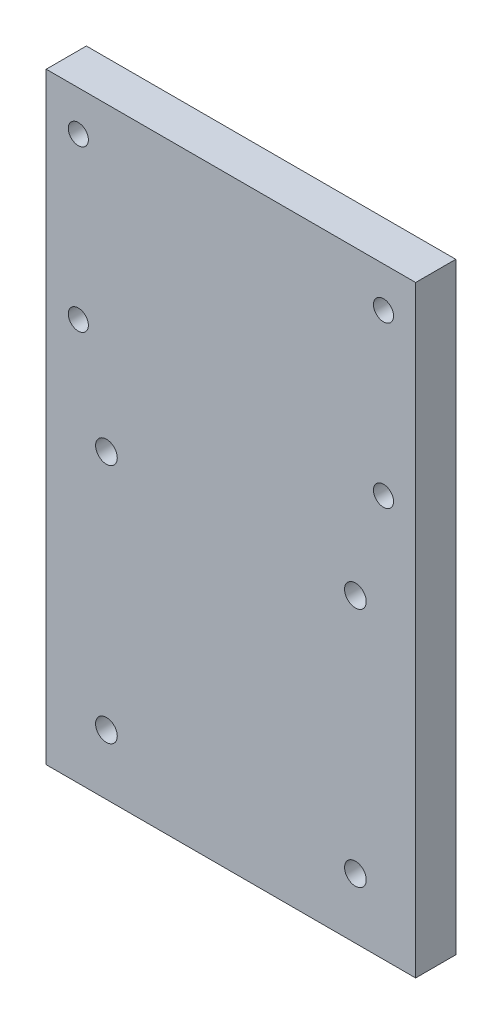
ISO-10303-21;
HEADER;
FILE_DESCRIPTION(('STEP AP214'),'2;1');
FILE_NAME('part.step','',(''),(''),'','','');
FILE_SCHEMA(('AUTOMOTIVE_DESIGN { 1 0 10303 214 1 1 1 1 }'));
ENDSEC;
DATA;
#1=APPLICATION_CONTEXT('core data for automotive mechanical design processes');
#2=APPLICATION_PROTOCOL_DEFINITION('international standard','automotive_design',2000,#1);
#3=PRODUCT_CONTEXT('',#1,'mechanical');
#4=PRODUCT('Part','Part','',(#3));
#5=PRODUCT_RELATED_PRODUCT_CATEGORY('part','',(#4));
#6=PRODUCT_DEFINITION_FORMATION('','',#4);
#7=PRODUCT_DEFINITION_CONTEXT('part definition',#1,'design');
#8=PRODUCT_DEFINITION('design','',#6,#7);
#9=PRODUCT_DEFINITION_SHAPE('','',#8);
#10=(LENGTH_UNIT() NAMED_UNIT(*) SI_UNIT(.MILLI.,.METRE.));
#11=(NAMED_UNIT(*) PLANE_ANGLE_UNIT() SI_UNIT($,.RADIAN.));
#12=(NAMED_UNIT(*) SI_UNIT($,.STERADIAN.) SOLID_ANGLE_UNIT());
#13=UNCERTAINTY_MEASURE_WITH_UNIT(LENGTH_MEASURE(1.E-05),#10,'distance_accuracy_value','');
#14=(GEOMETRIC_REPRESENTATION_CONTEXT(3) GLOBAL_UNCERTAINTY_ASSIGNED_CONTEXT((#13)) GLOBAL_UNIT_ASSIGNED_CONTEXT((#10,
#11,#12)) REPRESENTATION_CONTEXT('',''));
#15=CARTESIAN_POINT('',(0.,0.,0.));
#16=DIRECTION('',(0.,0.,1.));
#17=DIRECTION('',(1.,0.,0.));
#18=AXIS2_PLACEMENT_3D('',#15,#16,#17);
#19=CARTESIAN_POINT('',(0.,0.,5.));
#20=DIRECTION('',(0.,0.,-1.));
#21=DIRECTION('',(-1.,0.,0.));
#22=AXIS2_PLACEMENT_3D('',#19,#20,#21);
#23=PLANE('',#22);
#24=DIRECTION('',(0.,-1.,0.));
#25=VECTOR('',#24,1.);
#26=CARTESIAN_POINT('',(-23.,-37.5,5.));
#27=LINE('',#26,#25);
#28=CARTESIAN_POINT('',(-23.,37.5,5.));
#29=VERTEX_POINT('',#28);
#30=CARTESIAN_POINT('',(-23.,-37.5,5.));
#31=VERTEX_POINT('',#30);
#32=EDGE_CURVE('E86',#29,#31,#27,.T.);
#33=ORIENTED_EDGE('',*,*,#32,.T.);
#34=DIRECTION('',(1.,0.,0.));
#35=VECTOR('',#34,1.);
#36=CARTESIAN_POINT('',(-23.,-37.5,5.));
#37=LINE('',#36,#35);
#38=CARTESIAN_POINT('',(23.,-37.5,5.));
#39=VERTEX_POINT('',#38);
#40=EDGE_CURVE('E81',#31,#39,#37,.T.);
#41=ORIENTED_EDGE('',*,*,#40,.T.);
#42=DIRECTION('',(0.,1.,0.));
#43=VECTOR('',#42,1.);
#44=CARTESIAN_POINT('',(23.,-37.5,5.));
#45=LINE('',#44,#43);
#46=CARTESIAN_POINT('',(23.,37.5,5.));
#47=VERTEX_POINT('',#46);
#48=EDGE_CURVE('E84',#39,#47,#45,.T.);
#49=ORIENTED_EDGE('',*,*,#48,.T.);
#50=DIRECTION('',(-1.,0.,0.));
#51=VECTOR('',#50,1.);
#52=CARTESIAN_POINT('',(-23.,37.5,5.));
#53=LINE('',#52,#51);
#54=EDGE_CURVE('E51',#47,#29,#53,.T.);
#55=ORIENTED_EDGE('',*,*,#54,.T.);
#56=EDGE_LOOP('',(#33,#41,#49,#55));
#57=FACE_BOUND('',#56,.T.);
#58=CARTESIAN_POINT('',(-19.,32.5,5.));
#59=DIRECTION('',(0.,0.,1.));
#60=DIRECTION('',(1.,0.,0.));
#61=AXIS2_PLACEMENT_3D('',#58,#59,#60);
#62=CIRCLE('',#61,1.25);
#63=CARTESIAN_POINT('',(-17.75,32.5,5.));
#64=VERTEX_POINT('',#63);
#65=EDGE_CURVE('E101',#64,#64,#62,.T.);
#66=ORIENTED_EDGE('',*,*,#65,.F.);
#67=EDGE_LOOP('',(#66));
#68=FACE_BOUND('',#67,.T.);
#69=CARTESIAN_POINT('',(-15.5,-30.,5.));
#70=DIRECTION('',(0.,0.,1.));
#71=DIRECTION('',(1.,0.,0.));
#72=AXIS2_PLACEMENT_3D('',#69,#70,#71);
#73=CIRCLE('',#72,1.35);
#74=CARTESIAN_POINT('',(-14.15,-30.,5.));
#75=VERTEX_POINT('',#74);
#76=EDGE_CURVE('E116',#75,#75,#73,.T.);
#77=ORIENTED_EDGE('',*,*,#76,.F.);
#78=EDGE_LOOP('',(#77));
#79=FACE_BOUND('',#78,.T.);
#80=CARTESIAN_POINT('',(-15.5,0.,5.));
#81=DIRECTION('',(0.,0.,1.));
#82=DIRECTION('',(1.,0.,0.));
#83=AXIS2_PLACEMENT_3D('',#80,#81,#82);
#84=CIRCLE('',#83,1.35000000000001);
#85=CARTESIAN_POINT('',(-14.15,0.,5.));
#86=VERTEX_POINT('',#85);
#87=EDGE_CURVE('E122',#86,#86,#84,.T.);
#88=ORIENTED_EDGE('',*,*,#87,.F.);
#89=EDGE_LOOP('',(#88));
#90=FACE_BOUND('',#89,.T.);
#91=CARTESIAN_POINT('',(15.5,-30.,5.));
#92=DIRECTION('',(0.,0.,1.));
#93=DIRECTION('',(-1.,0.,0.));
#94=AXIS2_PLACEMENT_3D('',#91,#92,#93);
#95=CIRCLE('',#94,1.35);
#96=CARTESIAN_POINT('',(14.15,-30.,5.));
#97=VERTEX_POINT('',#96);
#98=EDGE_CURVE('E128',#97,#97,#95,.T.);
#99=ORIENTED_EDGE('',*,*,#98,.F.);
#100=EDGE_LOOP('',(#99));
#101=FACE_BOUND('',#100,.T.);
#102=CARTESIAN_POINT('',(15.5,0.,5.));
#103=DIRECTION('',(0.,0.,1.));
#104=DIRECTION('',(-1.,0.,0.));
#105=AXIS2_PLACEMENT_3D('',#102,#103,#104);
#106=CIRCLE('',#105,1.35000000000001);
#107=CARTESIAN_POINT('',(14.15,0.,5.));
#108=VERTEX_POINT('',#107);
#109=EDGE_CURVE('E134',#108,#108,#106,.T.);
#110=ORIENTED_EDGE('',*,*,#109,.F.);
#111=EDGE_LOOP('',(#110));
#112=FACE_BOUND('',#111,.T.);
#113=CARTESIAN_POINT('',(19.,32.5,5.));
#114=DIRECTION('',(0.,0.,1.));
#115=DIRECTION('',(-1.,0.,0.));
#116=AXIS2_PLACEMENT_3D('',#113,#114,#115);
#117=CIRCLE('',#116,1.25);
#118=CARTESIAN_POINT('',(17.75,32.5,5.));
#119=VERTEX_POINT('',#118);
#120=EDGE_CURVE('E140',#119,#119,#117,.T.);
#121=ORIENTED_EDGE('',*,*,#120,.F.);
#122=EDGE_LOOP('',(#121));
#123=FACE_BOUND('',#122,.T.);
#124=CARTESIAN_POINT('',(-19.,12.5,5.));
#125=DIRECTION('',(0.,0.,1.));
#126=DIRECTION('',(1.,0.,0.));
#127=AXIS2_PLACEMENT_3D('',#124,#125,#126);
#128=CIRCLE('',#127,1.25);
#129=CARTESIAN_POINT('',(-17.75,12.5,5.));
#130=VERTEX_POINT('',#129);
#131=EDGE_CURVE('E146',#130,#130,#128,.T.);
#132=ORIENTED_EDGE('',*,*,#131,.F.);
#133=EDGE_LOOP('',(#132));
#134=FACE_BOUND('',#133,.T.);
#135=CARTESIAN_POINT('',(19.,12.5,5.));
#136=DIRECTION('',(0.,0.,1.));
#137=DIRECTION('',(-1.,0.,0.));
#138=AXIS2_PLACEMENT_3D('',#135,#136,#137);
#139=CIRCLE('',#138,1.25);
#140=CARTESIAN_POINT('',(17.75,12.5,5.));
#141=VERTEX_POINT('',#140);
#142=EDGE_CURVE('E152',#141,#141,#139,.T.);
#143=ORIENTED_EDGE('',*,*,#142,.F.);
#144=EDGE_LOOP('',(#143));
#145=FACE_BOUND('',#144,.T.);
#146=ADVANCED_FACE('F34',(#57,#68,#79,#90,#101,#112,#123,#134,#145),#23,.F.);
#147=CARTESIAN_POINT('',(0.,0.,0.));
#148=DIRECTION('',(0.,0.,-1.));
#149=DIRECTION('',(-1.,0.,0.));
#150=AXIS2_PLACEMENT_3D('',#147,#148,#149);
#151=PLANE('',#150);
#152=CARTESIAN_POINT('',(-19.,12.5,0.));
#153=DIRECTION('',(0.,0.,1.));
#154=DIRECTION('',(1.,0.,0.));
#155=AXIS2_PLACEMENT_3D('',#152,#153,#154);
#156=CIRCLE('',#155,1.25);
#157=CARTESIAN_POINT('',(-17.75,12.5,0.));
#158=VERTEX_POINT('',#157);
#159=EDGE_CURVE('E149',#158,#158,#156,.T.);
#160=ORIENTED_EDGE('',*,*,#159,.T.);
#161=EDGE_LOOP('',(#160));
#162=FACE_BOUND('',#161,.T.);
#163=CARTESIAN_POINT('',(15.5,0.,0.));
#164=DIRECTION('',(0.,0.,1.));
#165=DIRECTION('',(-1.,0.,0.));
#166=AXIS2_PLACEMENT_3D('',#163,#164,#165);
#167=CIRCLE('',#166,1.35000000000001);
#168=CARTESIAN_POINT('',(14.15,0.,0.));
#169=VERTEX_POINT('',#168);
#170=EDGE_CURVE('E137',#169,#169,#167,.T.);
#171=ORIENTED_EDGE('',*,*,#170,.T.);
#172=EDGE_LOOP('',(#171));
#173=FACE_BOUND('',#172,.T.);
#174=CARTESIAN_POINT('',(-15.5,0.,0.));
#175=DIRECTION('',(0.,0.,1.));
#176=DIRECTION('',(1.,0.,0.));
#177=AXIS2_PLACEMENT_3D('',#174,#175,#176);
#178=CIRCLE('',#177,1.35000000000001);
#179=CARTESIAN_POINT('',(-14.15,0.,0.));
#180=VERTEX_POINT('',#179);
#181=EDGE_CURVE('E125',#180,#180,#178,.T.);
#182=ORIENTED_EDGE('',*,*,#181,.T.);
#183=EDGE_LOOP('',(#182));
#184=FACE_BOUND('',#183,.T.);
#185=CARTESIAN_POINT('',(-19.,32.5,0.));
#186=DIRECTION('',(0.,0.,1.));
#187=DIRECTION('',(1.,0.,0.));
#188=AXIS2_PLACEMENT_3D('',#185,#186,#187);
#189=CIRCLE('',#188,1.25);
#190=CARTESIAN_POINT('',(-17.75,32.5,0.));
#191=VERTEX_POINT('',#190);
#192=EDGE_CURVE('E113',#191,#191,#189,.T.);
#193=ORIENTED_EDGE('',*,*,#192,.T.);
#194=EDGE_LOOP('',(#193));
#195=FACE_BOUND('',#194,.T.);
#196=DIRECTION('',(0.,-1.,0.));
#197=VECTOR('',#196,1.);
#198=CARTESIAN_POINT('',(-23.,-37.5,0.));
#199=LINE('',#198,#197);
#200=CARTESIAN_POINT('',(-23.,37.5,0.));
#201=VERTEX_POINT('',#200);
#202=CARTESIAN_POINT('',(-23.,-37.5,0.));
#203=VERTEX_POINT('',#202);
#204=EDGE_CURVE('E98',#201,#203,#199,.T.);
#205=ORIENTED_EDGE('',*,*,#204,.F.);
#206=DIRECTION('',(-1.,0.,0.));
#207=VECTOR('',#206,1.);
#208=CARTESIAN_POINT('',(-23.,37.5,0.));
#209=LINE('',#208,#207);
#210=CARTESIAN_POINT('',(23.,37.5,0.));
#211=VERTEX_POINT('',#210);
#212=EDGE_CURVE('E74',#211,#201,#209,.T.);
#213=ORIENTED_EDGE('',*,*,#212,.F.);
#214=DIRECTION('',(0.,1.,0.));
#215=VECTOR('',#214,1.);
#216=CARTESIAN_POINT('',(23.,-37.5,0.));
#217=LINE('',#216,#215);
#218=CARTESIAN_POINT('',(23.,-37.5,0.));
#219=VERTEX_POINT('',#218);
#220=EDGE_CURVE('E68',#219,#211,#217,.T.);
#221=ORIENTED_EDGE('',*,*,#220,.F.);
#222=DIRECTION('',(1.,0.,0.));
#223=VECTOR('',#222,1.);
#224=CARTESIAN_POINT('',(-23.,-37.5,0.));
#225=LINE('',#224,#223);
#226=EDGE_CURVE('E90',#203,#219,#225,.T.);
#227=ORIENTED_EDGE('',*,*,#226,.F.);
#228=EDGE_LOOP('',(#205,#213,#221,#227));
#229=FACE_BOUND('',#228,.T.);
#230=CARTESIAN_POINT('',(-15.5,-30.,0.));
#231=DIRECTION('',(0.,0.,1.));
#232=DIRECTION('',(1.,0.,0.));
#233=AXIS2_PLACEMENT_3D('',#230,#231,#232);
#234=CIRCLE('',#233,1.35);
#235=CARTESIAN_POINT('',(-14.15,-30.,0.));
#236=VERTEX_POINT('',#235);
#237=EDGE_CURVE('E119',#236,#236,#234,.T.);
#238=ORIENTED_EDGE('',*,*,#237,.T.);
#239=EDGE_LOOP('',(#238));
#240=FACE_BOUND('',#239,.T.);
#241=CARTESIAN_POINT('',(15.5,-30.,0.));
#242=DIRECTION('',(0.,0.,1.));
#243=DIRECTION('',(-1.,0.,0.));
#244=AXIS2_PLACEMENT_3D('',#241,#242,#243);
#245=CIRCLE('',#244,1.35);
#246=CARTESIAN_POINT('',(14.15,-30.,0.));
#247=VERTEX_POINT('',#246);
#248=EDGE_CURVE('E131',#247,#247,#245,.T.);
#249=ORIENTED_EDGE('',*,*,#248,.T.);
#250=EDGE_LOOP('',(#249));
#251=FACE_BOUND('',#250,.T.);
#252=CARTESIAN_POINT('',(19.,32.5,0.));
#253=DIRECTION('',(0.,0.,1.));
#254=DIRECTION('',(-1.,0.,0.));
#255=AXIS2_PLACEMENT_3D('',#252,#253,#254);
#256=CIRCLE('',#255,1.25);
#257=CARTESIAN_POINT('',(17.75,32.5,0.));
#258=VERTEX_POINT('',#257);
#259=EDGE_CURVE('E143',#258,#258,#256,.T.);
#260=ORIENTED_EDGE('',*,*,#259,.T.);
#261=EDGE_LOOP('',(#260));
#262=FACE_BOUND('',#261,.T.);
#263=CARTESIAN_POINT('',(19.,12.5,0.));
#264=DIRECTION('',(0.,0.,1.));
#265=DIRECTION('',(-1.,0.,0.));
#266=AXIS2_PLACEMENT_3D('',#263,#264,#265);
#267=CIRCLE('',#266,1.25);
#268=CARTESIAN_POINT('',(17.75,12.5,0.));
#269=VERTEX_POINT('',#268);
#270=EDGE_CURVE('E155',#269,#269,#267,.T.);
#271=ORIENTED_EDGE('',*,*,#270,.T.);
#272=EDGE_LOOP('',(#271));
#273=FACE_BOUND('',#272,.T.);
#274=ADVANCED_FACE('F109',(#162,#173,#184,#195,#229,#240,#251,#262,#273),#151,.T.);
#275=CARTESIAN_POINT('',(-23.,-37.5,5.));
#276=DIRECTION('',(1.,0.,0.));
#277=DIRECTION('',(0.,0.,-1.));
#278=AXIS2_PLACEMENT_3D('',#275,#276,#277);
#279=PLANE('',#278);
#280=ORIENTED_EDGE('',*,*,#204,.T.);
#281=DIRECTION('',(0.,0.,-1.));
#282=VECTOR('',#281,1.);
#283=CARTESIAN_POINT('',(-23.,-37.5,5.));
#284=LINE('',#283,#282);
#285=EDGE_CURVE('E11',#31,#203,#284,.T.);
#286=ORIENTED_EDGE('',*,*,#285,.F.);
#287=ORIENTED_EDGE('',*,*,#32,.F.);
#288=DIRECTION('',(0.,0.,-1.));
#289=VECTOR('',#288,1.);
#290=CARTESIAN_POINT('',(-23.,37.5,5.));
#291=LINE('',#290,#289);
#292=EDGE_CURVE('E94',#29,#201,#291,.T.);
#293=ORIENTED_EDGE('',*,*,#292,.T.);
#294=EDGE_LOOP('',(#280,#286,#287,#293));
#295=FACE_BOUND('',#294,.T.);
#296=ADVANCED_FACE('F36',(#295),#279,.F.);
#297=CARTESIAN_POINT('',(-23.,-37.5,5.));
#298=DIRECTION('',(0.,1.,0.));
#299=DIRECTION('',(0.,0.,1.));
#300=AXIS2_PLACEMENT_3D('',#297,#298,#299);
#301=PLANE('',#300);
#302=ORIENTED_EDGE('',*,*,#226,.T.);
#303=DIRECTION('',(0.,0.,-1.));
#304=VECTOR('',#303,1.);
#305=CARTESIAN_POINT('',(23.,-37.5,5.));
#306=LINE('',#305,#304);
#307=EDGE_CURVE('E43',#39,#219,#306,.T.);
#308=ORIENTED_EDGE('',*,*,#307,.F.);
#309=ORIENTED_EDGE('',*,*,#40,.F.);
#310=ORIENTED_EDGE('',*,*,#285,.T.);
#311=EDGE_LOOP('',(#302,#308,#309,#310));
#312=FACE_BOUND('',#311,.T.);
#313=ADVANCED_FACE('F89',(#312),#301,.F.);
#314=CARTESIAN_POINT('',(23.,-37.5,5.));
#315=DIRECTION('',(-1.,0.,0.));
#316=DIRECTION('',(0.,0.,1.));
#317=AXIS2_PLACEMENT_3D('',#314,#315,#316);
#318=PLANE('',#317);
#319=ORIENTED_EDGE('',*,*,#220,.T.);
#320=DIRECTION('',(0.,0.,-1.));
#321=VECTOR('',#320,1.);
#322=CARTESIAN_POINT('',(23.,37.5,5.));
#323=LINE('',#322,#321);
#324=EDGE_CURVE('E91',#47,#211,#323,.T.);
#325=ORIENTED_EDGE('',*,*,#324,.F.);
#326=ORIENTED_EDGE('',*,*,#48,.F.);
#327=ORIENTED_EDGE('',*,*,#307,.T.);
#328=EDGE_LOOP('',(#319,#325,#326,#327));
#329=FACE_BOUND('',#328,.T.);
#330=ADVANCED_FACE('F92',(#329),#318,.F.);
#331=CARTESIAN_POINT('',(-23.,37.5,5.));
#332=DIRECTION('',(0.,-1.,0.));
#333=DIRECTION('',(0.,0.,-1.));
#334=AXIS2_PLACEMENT_3D('',#331,#332,#333);
#335=PLANE('',#334);
#336=ORIENTED_EDGE('',*,*,#212,.T.);
#337=ORIENTED_EDGE('',*,*,#292,.F.);
#338=ORIENTED_EDGE('',*,*,#54,.F.);
#339=ORIENTED_EDGE('',*,*,#324,.T.);
#340=EDGE_LOOP('',(#336,#337,#338,#339));
#341=FACE_BOUND('',#340,.T.);
#342=ADVANCED_FACE('F106',(#341),#335,.F.);
#343=CARTESIAN_POINT('',(-19.,32.5,5.));
#344=DIRECTION('',(0.,0.,-1.));
#345=DIRECTION('',(-1.,0.,0.));
#346=AXIS2_PLACEMENT_3D('',#343,#344,#345);
#347=CYLINDRICAL_SURFACE('',#346,1.25);
#348=ORIENTED_EDGE('',*,*,#65,.T.);
#349=EDGE_LOOP('',(#348));
#350=FACE_BOUND('',#349,.T.);
#351=ORIENTED_EDGE('',*,*,#192,.F.);
#352=EDGE_LOOP('',(#351));
#353=FACE_BOUND('',#352,.T.);
#354=ADVANCED_FACE('F172',(#350,#353),#347,.F.);
#355=CARTESIAN_POINT('',(-15.5,-30.,5.));
#356=DIRECTION('',(0.,0.,-1.));
#357=DIRECTION('',(-1.,0.,0.));
#358=AXIS2_PLACEMENT_3D('',#355,#356,#357);
#359=CYLINDRICAL_SURFACE('',#358,1.35);
#360=ORIENTED_EDGE('',*,*,#76,.T.);
#361=EDGE_LOOP('',(#360));
#362=FACE_BOUND('',#361,.T.);
#363=ORIENTED_EDGE('',*,*,#237,.F.);
#364=EDGE_LOOP('',(#363));
#365=FACE_BOUND('',#364,.T.);
#366=ADVANCED_FACE('F218',(#362,#365),#359,.F.);
#367=CARTESIAN_POINT('',(-15.5,0.,5.));
#368=DIRECTION('',(0.,0.,-1.));
#369=DIRECTION('',(-1.,0.,0.));
#370=AXIS2_PLACEMENT_3D('',#367,#368,#369);
#371=CYLINDRICAL_SURFACE('',#370,1.35000000000001);
#372=ORIENTED_EDGE('',*,*,#87,.T.);
#373=EDGE_LOOP('',(#372));
#374=FACE_BOUND('',#373,.T.);
#375=ORIENTED_EDGE('',*,*,#181,.F.);
#376=EDGE_LOOP('',(#375));
#377=FACE_BOUND('',#376,.T.);
#378=ADVANCED_FACE('F226',(#374,#377),#371,.F.);
#379=CARTESIAN_POINT('',(15.5,-30.,5.));
#380=DIRECTION('',(0.,0.,-1.));
#381=DIRECTION('',(-1.,0.,0.));
#382=AXIS2_PLACEMENT_3D('',#379,#380,#381);
#383=CYLINDRICAL_SURFACE('',#382,1.35);
#384=ORIENTED_EDGE('',*,*,#98,.T.);
#385=EDGE_LOOP('',(#384));
#386=FACE_BOUND('',#385,.T.);
#387=ORIENTED_EDGE('',*,*,#248,.F.);
#388=EDGE_LOOP('',(#387));
#389=FACE_BOUND('',#388,.T.);
#390=ADVANCED_FACE('F234',(#386,#389),#383,.F.);
#391=CARTESIAN_POINT('',(15.5,0.,5.));
#392=DIRECTION('',(0.,0.,-1.));
#393=DIRECTION('',(-1.,0.,0.));
#394=AXIS2_PLACEMENT_3D('',#391,#392,#393);
#395=CYLINDRICAL_SURFACE('',#394,1.35000000000001);
#396=ORIENTED_EDGE('',*,*,#109,.T.);
#397=EDGE_LOOP('',(#396));
#398=FACE_BOUND('',#397,.T.);
#399=ORIENTED_EDGE('',*,*,#170,.F.);
#400=EDGE_LOOP('',(#399));
#401=FACE_BOUND('',#400,.T.);
#402=ADVANCED_FACE('F243',(#398,#401),#395,.F.);
#403=CARTESIAN_POINT('',(19.,32.5,5.));
#404=DIRECTION('',(0.,0.,-1.));
#405=DIRECTION('',(-1.,0.,0.));
#406=AXIS2_PLACEMENT_3D('',#403,#404,#405);
#407=CYLINDRICAL_SURFACE('',#406,1.25);
#408=ORIENTED_EDGE('',*,*,#120,.T.);
#409=EDGE_LOOP('',(#408));
#410=FACE_BOUND('',#409,.T.);
#411=ORIENTED_EDGE('',*,*,#259,.F.);
#412=EDGE_LOOP('',(#411));
#413=FACE_BOUND('',#412,.T.);
#414=ADVANCED_FACE('F252',(#410,#413),#407,.F.);
#415=CARTESIAN_POINT('',(-19.,12.5,5.));
#416=DIRECTION('',(0.,0.,-1.));
#417=DIRECTION('',(-1.,0.,0.));
#418=AXIS2_PLACEMENT_3D('',#415,#416,#417);
#419=CYLINDRICAL_SURFACE('',#418,1.25);
#420=ORIENTED_EDGE('',*,*,#131,.T.);
#421=EDGE_LOOP('',(#420));
#422=FACE_BOUND('',#421,.T.);
#423=ORIENTED_EDGE('',*,*,#159,.F.);
#424=EDGE_LOOP('',(#423));
#425=FACE_BOUND('',#424,.T.);
#426=ADVANCED_FACE('F261',(#422,#425),#419,.F.);
#427=CARTESIAN_POINT('',(19.,12.5,5.));
#428=DIRECTION('',(0.,0.,-1.));
#429=DIRECTION('',(-1.,0.,0.));
#430=AXIS2_PLACEMENT_3D('',#427,#428,#429);
#431=CYLINDRICAL_SURFACE('',#430,1.25);
#432=ORIENTED_EDGE('',*,*,#142,.T.);
#433=EDGE_LOOP('',(#432));
#434=FACE_BOUND('',#433,.T.);
#435=ORIENTED_EDGE('',*,*,#270,.F.);
#436=EDGE_LOOP('',(#435));
#437=FACE_BOUND('',#436,.T.);
#438=ADVANCED_FACE('F161',(#434,#437),#431,.F.);
#439=CLOSED_SHELL('',(#146,#274,#296,#313,#330,#342,#354,#366,#378,#390,#402,#414,#426,#438));
#440=MANIFOLD_SOLID_BREP('B2',#439);
#441=ADVANCED_BREP_SHAPE_REPRESENTATION('',(#18,#440),#14);
#442=SHAPE_DEFINITION_REPRESENTATION(#9,#441);
ENDSEC;
END-ISO-10303-21;
